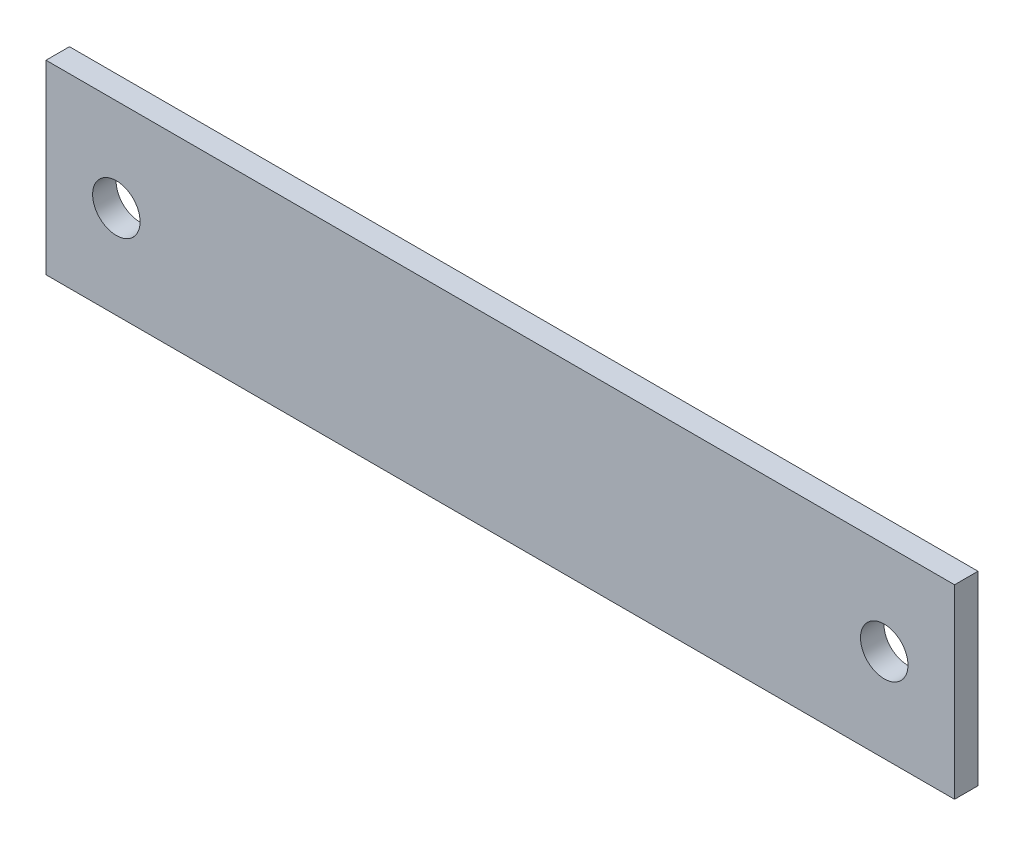
ISO-10303-21;
HEADER;
FILE_DESCRIPTION(('STEP AP214'),'2;1');
FILE_NAME('part.step','',(''),(''),'','','');
FILE_SCHEMA(('AUTOMOTIVE_DESIGN { 1 0 10303 214 1 1 1 1 }'));
ENDSEC;
DATA;
#1=APPLICATION_CONTEXT('core data for automotive mechanical design processes');
#2=APPLICATION_PROTOCOL_DEFINITION('international standard','automotive_design',2000,#1);
#3=PRODUCT_CONTEXT('',#1,'mechanical');
#4=PRODUCT('Part','Part','',(#3));
#5=PRODUCT_RELATED_PRODUCT_CATEGORY('part','',(#4));
#6=PRODUCT_DEFINITION_FORMATION('','',#4);
#7=PRODUCT_DEFINITION_CONTEXT('part definition',#1,'design');
#8=PRODUCT_DEFINITION('design','',#6,#7);
#9=PRODUCT_DEFINITION_SHAPE('','',#8);
#10=(LENGTH_UNIT() NAMED_UNIT(*) SI_UNIT(.MILLI.,.METRE.));
#11=(NAMED_UNIT(*) PLANE_ANGLE_UNIT() SI_UNIT($,.RADIAN.));
#12=(NAMED_UNIT(*) SI_UNIT($,.STERADIAN.) SOLID_ANGLE_UNIT());
#13=UNCERTAINTY_MEASURE_WITH_UNIT(LENGTH_MEASURE(1.E-05),#10,'distance_accuracy_value','');
#14=(GEOMETRIC_REPRESENTATION_CONTEXT(3) GLOBAL_UNCERTAINTY_ASSIGNED_CONTEXT((#13)) GLOBAL_UNIT_ASSIGNED_CONTEXT((#10,
#11,#12)) REPRESENTATION_CONTEXT('',''));
#15=CARTESIAN_POINT('',(0.,0.,0.));
#16=DIRECTION('',(0.,0.,1.));
#17=DIRECTION('',(1.,0.,0.));
#18=AXIS2_PLACEMENT_3D('',#15,#16,#17);
#19=CARTESIAN_POINT('',(0.,0.,4.));
#20=DIRECTION('',(0.,0.,1.));
#21=DIRECTION('',(1.,0.,0.));
#22=AXIS2_PLACEMENT_3D('',#19,#20,#21);
#23=PLANE('',#22);
#24=CARTESIAN_POINT('',(-65.5,0.,4.));
#25=DIRECTION('',(0.,0.,-1.));
#26=DIRECTION('',(-1.,0.,0.));
#27=AXIS2_PLACEMENT_3D('',#24,#25,#26);
#28=CIRCLE('',#27,4.05);
#29=CARTESIAN_POINT('',(-61.45,0.,4.));
#30=VERTEX_POINT('',#29);
#31=EDGE_CURVE('E106',#30,#30,#28,.T.);
#32=ORIENTED_EDGE('',*,*,#31,.T.);
#33=EDGE_LOOP('',(#32));
#34=FACE_BOUND('',#33,.T.);
#35=CARTESIAN_POINT('',(65.5,0.,4.));
#36=DIRECTION('',(0.,0.,-1.));
#37=DIRECTION('',(-1.,0.,0.));
#38=AXIS2_PLACEMENT_3D('',#35,#36,#37);
#39=CIRCLE('',#38,4.05);
#40=CARTESIAN_POINT('',(69.55,0.,4.));
#41=VERTEX_POINT('',#40);
#42=EDGE_CURVE('E129',#41,#41,#39,.T.);
#43=ORIENTED_EDGE('',*,*,#42,.T.);
#44=EDGE_LOOP('',(#43));
#45=FACE_BOUND('',#44,.T.);
#46=DIRECTION('',(-1.,0.,0.));
#47=VECTOR('',#46,1.);
#48=CARTESIAN_POINT('',(-77.5,15.85,4.));
#49=LINE('',#48,#47);
#50=CARTESIAN_POINT('',(77.5,15.85,4.));
#51=VERTEX_POINT('',#50);
#52=CARTESIAN_POINT('',(-77.5,15.85,4.));
#53=VERTEX_POINT('',#52);
#54=EDGE_CURVE('E11',#51,#53,#49,.T.);
#55=ORIENTED_EDGE('',*,*,#54,.T.);
#56=DIRECTION('',(0.,-1.,0.));
#57=VECTOR('',#56,1.);
#58=CARTESIAN_POINT('',(-77.5,-15.85,4.));
#59=LINE('',#58,#57);
#60=CARTESIAN_POINT('',(-77.5,-15.85,4.));
#61=VERTEX_POINT('',#60);
#62=EDGE_CURVE('E72',#53,#61,#59,.T.);
#63=ORIENTED_EDGE('',*,*,#62,.T.);
#64=DIRECTION('',(1.,0.,0.));
#65=VECTOR('',#64,1.);
#66=CARTESIAN_POINT('',(77.5,-15.85,4.));
#67=LINE('',#66,#65);
#68=CARTESIAN_POINT('',(77.5,-15.85,4.));
#69=VERTEX_POINT('',#68);
#70=EDGE_CURVE('E75',#61,#69,#67,.T.);
#71=ORIENTED_EDGE('',*,*,#70,.T.);
#72=DIRECTION('',(0.,1.,0.));
#73=VECTOR('',#72,1.);
#74=CARTESIAN_POINT('',(77.5,15.85,4.));
#75=LINE('',#74,#73);
#76=EDGE_CURVE('E146',#69,#51,#75,.T.);
#77=ORIENTED_EDGE('',*,*,#76,.T.);
#78=EDGE_LOOP('',(#55,#63,#71,#77));
#79=FACE_BOUND('',#78,.T.);
#80=ADVANCED_FACE('F17',(#34,#45,#79),#23,.T.);
#81=CARTESIAN_POINT('',(0.,0.,0.));
#82=DIRECTION('',(0.,0.,1.));
#83=DIRECTION('',(1.,0.,0.));
#84=AXIS2_PLACEMENT_3D('',#81,#82,#83);
#85=PLANE('',#84);
#86=CARTESIAN_POINT('',(-65.5,0.,0.));
#87=DIRECTION('',(0.,0.,1.));
#88=DIRECTION('',(-1.,0.,0.));
#89=AXIS2_PLACEMENT_3D('',#86,#87,#88);
#90=CIRCLE('',#89,4.05);
#91=CARTESIAN_POINT('',(-61.45,0.,0.));
#92=VERTEX_POINT('',#91);
#93=EDGE_CURVE('E121',#92,#92,#90,.T.);
#94=ORIENTED_EDGE('',*,*,#93,.T.);
#95=EDGE_LOOP('',(#94));
#96=FACE_BOUND('',#95,.T.);
#97=CARTESIAN_POINT('',(65.5,0.,0.));
#98=DIRECTION('',(0.,0.,1.));
#99=DIRECTION('',(-1.,0.,0.));
#100=AXIS2_PLACEMENT_3D('',#97,#98,#99);
#101=CIRCLE('',#100,4.05);
#102=CARTESIAN_POINT('',(69.55,0.,0.));
#103=VERTEX_POINT('',#102);
#104=EDGE_CURVE('E143',#103,#103,#101,.T.);
#105=ORIENTED_EDGE('',*,*,#104,.T.);
#106=EDGE_LOOP('',(#105));
#107=FACE_BOUND('',#106,.T.);
#108=DIRECTION('',(1.,0.,0.));
#109=VECTOR('',#108,1.);
#110=CARTESIAN_POINT('',(-77.5,15.85,0.));
#111=LINE('',#110,#109);
#112=CARTESIAN_POINT('',(-77.5,15.85,0.));
#113=VERTEX_POINT('',#112);
#114=CARTESIAN_POINT('',(77.5,15.85,0.));
#115=VERTEX_POINT('',#114);
#116=EDGE_CURVE('E28',#113,#115,#111,.T.);
#117=ORIENTED_EDGE('',*,*,#116,.T.);
#118=DIRECTION('',(0.,-1.,0.));
#119=VECTOR('',#118,1.);
#120=CARTESIAN_POINT('',(77.5,15.85,0.));
#121=LINE('',#120,#119);
#122=CARTESIAN_POINT('',(77.5,-15.85,0.));
#123=VERTEX_POINT('',#122);
#124=EDGE_CURVE('E109',#115,#123,#121,.T.);
#125=ORIENTED_EDGE('',*,*,#124,.T.);
#126=DIRECTION('',(-1.,0.,0.));
#127=VECTOR('',#126,1.);
#128=CARTESIAN_POINT('',(77.5,-15.85,0.));
#129=LINE('',#128,#127);
#130=CARTESIAN_POINT('',(-77.5,-15.85,0.));
#131=VERTEX_POINT('',#130);
#132=EDGE_CURVE('E96',#123,#131,#129,.T.);
#133=ORIENTED_EDGE('',*,*,#132,.T.);
#134=DIRECTION('',(0.,1.,0.));
#135=VECTOR('',#134,1.);
#136=CARTESIAN_POINT('',(-77.5,-15.85,0.));
#137=LINE('',#136,#135);
#138=EDGE_CURVE('E81',#131,#113,#137,.T.);
#139=ORIENTED_EDGE('',*,*,#138,.T.);
#140=EDGE_LOOP('',(#117,#125,#133,#139));
#141=FACE_BOUND('',#140,.T.);
#142=ADVANCED_FACE('F19',(#96,#107,#141),#85,.F.);
#143=CARTESIAN_POINT('',(77.5,15.85,0.));
#144=DIRECTION('',(0.,1.,0.));
#145=DIRECTION('',(1.,0.,0.));
#146=AXIS2_PLACEMENT_3D('',#143,#144,#145);
#147=PLANE('',#146);
#148=ORIENTED_EDGE('',*,*,#116,.F.);
#149=DIRECTION('',(0.,0.,1.));
#150=VECTOR('',#149,1.);
#151=CARTESIAN_POINT('',(-77.5,15.85,0.));
#152=LINE('',#151,#150);
#153=EDGE_CURVE('E80',#113,#53,#152,.T.);
#154=ORIENTED_EDGE('',*,*,#153,.T.);
#155=ORIENTED_EDGE('',*,*,#54,.F.);
#156=DIRECTION('',(0.,0.,1.));
#157=VECTOR('',#156,1.);
#158=CARTESIAN_POINT('',(77.5,15.85,0.));
#159=LINE('',#158,#157);
#160=EDGE_CURVE('E118',#115,#51,#159,.T.);
#161=ORIENTED_EDGE('',*,*,#160,.F.);
#162=EDGE_LOOP('',(#148,#154,#155,#161));
#163=FACE_BOUND('',#162,.T.);
#164=ADVANCED_FACE('F171',(#163),#147,.T.);
#165=CARTESIAN_POINT('',(-77.5,15.85,0.));
#166=DIRECTION('',(-1.,0.,0.));
#167=DIRECTION('',(0.,0.,1.));
#168=AXIS2_PLACEMENT_3D('',#165,#166,#167);
#169=PLANE('',#168);
#170=ORIENTED_EDGE('',*,*,#138,.F.);
#171=DIRECTION('',(0.,0.,1.));
#172=VECTOR('',#171,1.);
#173=CARTESIAN_POINT('',(-77.5,-15.85,0.));
#174=LINE('',#173,#172);
#175=EDGE_CURVE('E84',#131,#61,#174,.T.);
#176=ORIENTED_EDGE('',*,*,#175,.T.);
#177=ORIENTED_EDGE('',*,*,#62,.F.);
#178=ORIENTED_EDGE('',*,*,#153,.F.);
#179=EDGE_LOOP('',(#170,#176,#177,#178));
#180=FACE_BOUND('',#179,.T.);
#181=ADVANCED_FACE('F85',(#180),#169,.T.);
#182=CARTESIAN_POINT('',(-77.5,-15.85,0.));
#183=DIRECTION('',(0.,-1.,0.));
#184=DIRECTION('',(0.,0.,-1.));
#185=AXIS2_PLACEMENT_3D('',#182,#183,#184);
#186=PLANE('',#185);
#187=ORIENTED_EDGE('',*,*,#132,.F.);
#188=DIRECTION('',(0.,0.,1.));
#189=VECTOR('',#188,1.);
#190=CARTESIAN_POINT('',(77.5,-15.85,0.));
#191=LINE('',#190,#189);
#192=EDGE_CURVE('E93',#123,#69,#191,.T.);
#193=ORIENTED_EDGE('',*,*,#192,.T.);
#194=ORIENTED_EDGE('',*,*,#70,.F.);
#195=ORIENTED_EDGE('',*,*,#175,.F.);
#196=EDGE_LOOP('',(#187,#193,#194,#195));
#197=FACE_BOUND('',#196,.T.);
#198=ADVANCED_FACE('F91',(#197),#186,.T.);
#199=CARTESIAN_POINT('',(77.5,-15.85,0.));
#200=DIRECTION('',(1.,0.,0.));
#201=DIRECTION('',(0.,1.,0.));
#202=AXIS2_PLACEMENT_3D('',#199,#200,#201);
#203=PLANE('',#202);
#204=ORIENTED_EDGE('',*,*,#124,.F.);
#205=ORIENTED_EDGE('',*,*,#160,.T.);
#206=ORIENTED_EDGE('',*,*,#76,.F.);
#207=ORIENTED_EDGE('',*,*,#192,.F.);
#208=EDGE_LOOP('',(#204,#205,#206,#207));
#209=FACE_BOUND('',#208,.T.);
#210=ADVANCED_FACE('F175',(#209),#203,.T.);
#211=CARTESIAN_POINT('',(-65.5,0.,0.));
#212=DIRECTION('',(0.,0.,1.));
#213=DIRECTION('',(-1.,0.,0.));
#214=AXIS2_PLACEMENT_3D('',#211,#212,#213);
#215=CYLINDRICAL_SURFACE('',#214,4.05);
#216=ORIENTED_EDGE('',*,*,#93,.F.);
#217=DIRECTION('',(0.,0.,1.));
#218=VECTOR('',#217,1.);
#219=CARTESIAN_POINT('',(-61.45,0.,0.));
#220=LINE('',#219,#218);
#221=EDGE_CURVE('E21',#92,#30,#220,.T.);
#222=ORIENTED_EDGE('',*,*,#221,.T.);
#223=ORIENTED_EDGE('',*,*,#31,.F.);
#224=ORIENTED_EDGE('',*,*,#221,.F.);
#225=EDGE_LOOP('',(#216,#222,#223,#224));
#226=FACE_BOUND('',#225,.T.);
#227=ADVANCED_FACE('F174',(#226),#215,.F.);
#228=CARTESIAN_POINT('',(65.5,0.,0.));
#229=DIRECTION('',(0.,0.,1.));
#230=DIRECTION('',(-1.,0.,0.));
#231=AXIS2_PLACEMENT_3D('',#228,#229,#230);
#232=CYLINDRICAL_SURFACE('',#231,4.05);
#233=ORIENTED_EDGE('',*,*,#104,.F.);
#234=DIRECTION('',(0.,0.,1.));
#235=VECTOR('',#234,1.);
#236=CARTESIAN_POINT('',(69.55,0.,0.));
#237=LINE('',#236,#235);
#238=EDGE_CURVE('E135',#103,#41,#237,.T.);
#239=ORIENTED_EDGE('',*,*,#238,.T.);
#240=ORIENTED_EDGE('',*,*,#42,.F.);
#241=ORIENTED_EDGE('',*,*,#238,.F.);
#242=EDGE_LOOP('',(#233,#239,#240,#241));
#243=FACE_BOUND('',#242,.T.);
#244=ADVANCED_FACE('F162',(#243),#232,.F.);
#245=CLOSED_SHELL('',(#80,#142,#164,#181,#198,#210,#227,#244));
#246=MANIFOLD_SOLID_BREP('B1',#245);
#247=ADVANCED_BREP_SHAPE_REPRESENTATION('',(#18,#246),#14);
#248=SHAPE_DEFINITION_REPRESENTATION(#9,#247);
ENDSEC;
END-ISO-10303-21;
